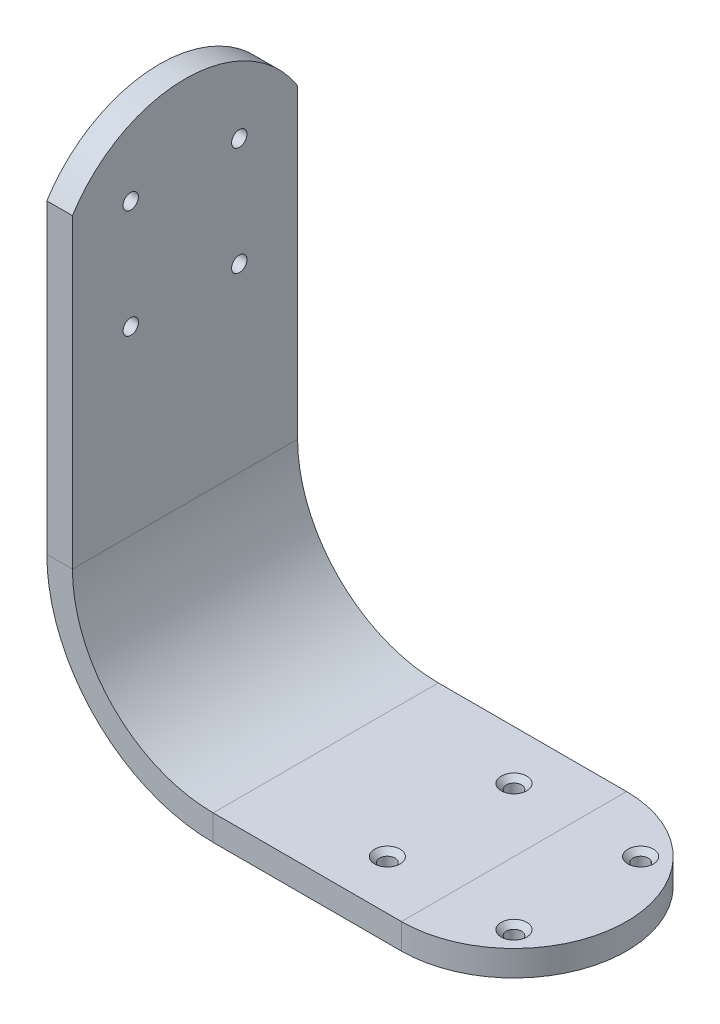
ISO-10303-21;
HEADER;
FILE_DESCRIPTION(('STEP AP214'),'2;1');
FILE_NAME('part.step','',(''),(''),'','','');
FILE_SCHEMA(('AUTOMOTIVE_DESIGN { 1 0 10303 214 1 1 1 1 }'));
ENDSEC;
DATA;
#1=APPLICATION_CONTEXT('core data for automotive mechanical design processes');
#2=APPLICATION_PROTOCOL_DEFINITION('international standard','automotive_design',2000,#1);
#3=PRODUCT_CONTEXT('',#1,'mechanical');
#4=PRODUCT('Part','Part','',(#3));
#5=PRODUCT_RELATED_PRODUCT_CATEGORY('part','',(#4));
#6=PRODUCT_DEFINITION_FORMATION('','',#4);
#7=PRODUCT_DEFINITION_CONTEXT('part definition',#1,'design');
#8=PRODUCT_DEFINITION('design','',#6,#7);
#9=PRODUCT_DEFINITION_SHAPE('','',#8);
#10=(LENGTH_UNIT() NAMED_UNIT(*) SI_UNIT(.MILLI.,.METRE.));
#11=(NAMED_UNIT(*) PLANE_ANGLE_UNIT() SI_UNIT($,.RADIAN.));
#12=(NAMED_UNIT(*) SI_UNIT($,.STERADIAN.) SOLID_ANGLE_UNIT());
#13=UNCERTAINTY_MEASURE_WITH_UNIT(LENGTH_MEASURE(1.E-05),#10,'distance_accuracy_value','');
#14=(GEOMETRIC_REPRESENTATION_CONTEXT(3) GLOBAL_UNCERTAINTY_ASSIGNED_CONTEXT((#13)) GLOBAL_UNIT_ASSIGNED_CONTEXT((#10,
#11,#12)) REPRESENTATION_CONTEXT('',''));
#15=CARTESIAN_POINT('',(0.,0.,0.));
#16=DIRECTION('',(0.,0.,1.));
#17=DIRECTION('',(1.,0.,0.));
#18=AXIS2_PLACEMENT_3D('',#15,#16,#17);
#19=CARTESIAN_POINT('',(66.7922831363969,-61.0217371749099,22.));
#20=DIRECTION('',(0.,-1.,0.));
#21=DIRECTION('',(1.,0.,0.));
#22=AXIS2_PLACEMENT_3D('',#19,#20,#21);
#23=PLANE('',#22);
#24=CARTESIAN_POINT('',(54.4179144656323,-61.0217371749096,12.3743686707647));
#25=DIRECTION('',(0.,1.,0.));
#26=DIRECTION('',(0.,0.,1.));
#27=AXIS2_PLACEMENT_3D('',#24,#25,#26);
#28=CIRCLE('',#27,1.5);
#29=CARTESIAN_POINT('',(54.4179144656323,-61.0217371749096,13.8743686707647));
#30=VERTEX_POINT('',#29);
#31=EDGE_CURVE('E221',#30,#30,#28,.T.);
#32=ORIENTED_EDGE('',*,*,#31,.T.);
#33=EDGE_LOOP('',(#32));
#34=FACE_BOUND('',#33,.T.);
#35=DIRECTION('',(-1.,0.,0.));
#36=VECTOR('',#35,1.);
#37=CARTESIAN_POINT('',(66.7922831363969,-61.0217371749099,22.));
#38=LINE('',#37,#36);
#39=CARTESIAN_POINT('',(66.7922831363969,-61.0217371749099,22.));
#40=VERTEX_POINT('',#39);
#41=CARTESIAN_POINT('',(30.,-61.0217371749097,22.));
#42=VERTEX_POINT('',#41);
#43=EDGE_CURVE('E149',#40,#42,#38,.T.);
#44=ORIENTED_EDGE('',*,*,#43,.T.);
#45=DIRECTION('',(0.,0.,1.));
#46=VECTOR('',#45,1.);
#47=CARTESIAN_POINT('',(30.,-61.0217371749097,22.));
#48=LINE('',#47,#46);
#49=CARTESIAN_POINT('',(30.,-61.0217371749097,-22.));
#50=VERTEX_POINT('',#49);
#51=EDGE_CURVE('E145',#50,#42,#48,.T.);
#52=ORIENTED_EDGE('',*,*,#51,.F.);
#53=DIRECTION('',(-1.,0.,0.));
#54=VECTOR('',#53,1.);
#55=CARTESIAN_POINT('',(66.7922831363969,-61.0217371749099,-22.));
#56=LINE('',#55,#54);
#57=CARTESIAN_POINT('',(66.7922831363969,-61.0217371749099,-22.));
#58=VERTEX_POINT('',#57);
#59=EDGE_CURVE('E150',#58,#50,#56,.T.);
#60=ORIENTED_EDGE('',*,*,#59,.F.);
#61=DIRECTION('',(0.,0.,1.));
#62=VECTOR('',#61,1.);
#63=CARTESIAN_POINT('',(66.7922831363969,-61.0217371749099,22.));
#64=LINE('',#63,#62);
#65=EDGE_CURVE('E140',#58,#40,#64,.T.);
#66=ORIENTED_EDGE('',*,*,#65,.T.);
#67=EDGE_LOOP('',(#44,#52,#60,#66));
#68=FACE_BOUND('',#67,.T.);
#69=CARTESIAN_POINT('',(54.4179144656323,-61.0217371749096,-12.3743686707645));
#70=DIRECTION('',(0.,1.,0.));
#71=DIRECTION('',(0.,0.,1.));
#72=AXIS2_PLACEMENT_3D('',#69,#70,#71);
#73=CIRCLE('',#72,1.5);
#74=CARTESIAN_POINT('',(54.4179144656323,-61.0217371749096,-10.8743686707645));
#75=VERTEX_POINT('',#74);
#76=EDGE_CURVE('E121',#75,#75,#73,.T.);
#77=ORIENTED_EDGE('',*,*,#76,.T.);
#78=EDGE_LOOP('',(#77));
#79=FACE_BOUND('',#78,.T.);
#80=ADVANCED_FACE('F41',(#34,#68,#79),#23,.T.);
#81=CARTESIAN_POINT('',(2.49999999999999,-28.5217371749097,22.));
#82=DIRECTION('',(1.,0.,0.));
#83=DIRECTION('',(0.,1.,0.));
#84=AXIS2_PLACEMENT_3D('',#81,#82,#83);
#85=PLANE('',#84);
#86=CARTESIAN_POINT('',(2.50000000000001,28.046875072252,-10.6066017177982));
#87=DIRECTION('',(1.,0.,0.));
#88=DIRECTION('',(0.,1.,0.));
#89=AXIS2_PLACEMENT_3D('',#86,#87,#88);
#90=CIRCLE('',#89,1.49999999999999);
#91=CARTESIAN_POINT('',(2.50000000000001,29.546875072252,-10.6066017177982));
#92=VERTEX_POINT('',#91);
#93=EDGE_CURVE('E45',#92,#92,#90,.T.);
#94=ORIENTED_EDGE('',*,*,#93,.F.);
#95=EDGE_LOOP('',(#94));
#96=FACE_BOUND('',#95,.T.);
#97=CARTESIAN_POINT('',(2.50000000000001,28.046875072252,10.6066017177982));
#98=DIRECTION('',(1.,0.,0.));
#99=DIRECTION('',(0.,1.,0.));
#100=AXIS2_PLACEMENT_3D('',#97,#98,#99);
#101=CIRCLE('',#100,1.49999999999999);
#102=CARTESIAN_POINT('',(2.50000000000001,29.546875072252,10.6066017177982));
#103=VERTEX_POINT('',#102);
#104=EDGE_CURVE('E179',#103,#103,#101,.T.);
#105=ORIENTED_EDGE('',*,*,#104,.F.);
#106=EDGE_LOOP('',(#105));
#107=FACE_BOUND('',#106,.T.);
#108=CARTESIAN_POINT('',(2.5,6.83367163665562,-10.6066017177983));
#109=DIRECTION('',(1.,0.,0.));
#110=DIRECTION('',(0.,1.,0.));
#111=AXIS2_PLACEMENT_3D('',#108,#109,#110);
#112=CIRCLE('',#111,1.49999999999999);
#113=CARTESIAN_POINT('',(2.5,8.33367163665561,-10.6066017177983));
#114=VERTEX_POINT('',#113);
#115=EDGE_CURVE('E175',#114,#114,#112,.T.);
#116=ORIENTED_EDGE('',*,*,#115,.F.);
#117=EDGE_LOOP('',(#116));
#118=FACE_BOUND('',#117,.T.);
#119=CARTESIAN_POINT('',(2.5,6.83367163665557,10.6066017177982));
#120=DIRECTION('',(1.,0.,0.));
#121=DIRECTION('',(0.,1.,0.));
#122=AXIS2_PLACEMENT_3D('',#119,#120,#121);
#123=CIRCLE('',#122,1.49999999999999);
#124=CARTESIAN_POINT('',(2.5,8.33367163665556,10.6066017177982));
#125=VERTEX_POINT('',#124);
#126=EDGE_CURVE('E170',#125,#125,#123,.T.);
#127=ORIENTED_EDGE('',*,*,#126,.F.);
#128=EDGE_LOOP('',(#127));
#129=FACE_BOUND('',#128,.T.);
#130=DIRECTION('',(0.,1.,0.));
#131=VECTOR('',#130,1.);
#132=CARTESIAN_POINT('',(2.49999999999999,-28.5217371749097,-22.));
#133=LINE('',#132,#131);
#134=CARTESIAN_POINT('',(2.49999999999999,-28.5217371749097,-22.));
#135=VERTEX_POINT('',#134);
#136=CARTESIAN_POINT('',(2.50000000000002,31.2966798150048,-22.));
#137=VERTEX_POINT('',#136);
#138=EDGE_CURVE('E128',#135,#137,#133,.T.);
#139=ORIENTED_EDGE('',*,*,#138,.T.);
#140=CARTESIAN_POINT('',(2.5,17.4402733544538,0.));
#141=DIRECTION('',(1.,0.,0.));
#142=DIRECTION('',(0.,1.,0.));
#143=AXIS2_PLACEMENT_3D('',#140,#141,#142);
#144=CIRCLE('',#143,26.);
#145=CARTESIAN_POINT('',(2.50000000000002,31.2966798150048,22.));
#146=VERTEX_POINT('',#145);
#147=EDGE_CURVE('E111',#137,#146,#144,.T.);
#148=ORIENTED_EDGE('',*,*,#147,.T.);
#149=DIRECTION('',(0.,1.,0.));
#150=VECTOR('',#149,1.);
#151=CARTESIAN_POINT('',(2.49999999999999,-28.5217371749097,22.));
#152=LINE('',#151,#150);
#153=CARTESIAN_POINT('',(2.49999999999999,-28.5217371749097,22.));
#154=VERTEX_POINT('',#153);
#155=EDGE_CURVE('E134',#154,#146,#152,.T.);
#156=ORIENTED_EDGE('',*,*,#155,.F.);
#157=DIRECTION('',(0.,0.,-1.));
#158=VECTOR('',#157,1.);
#159=CARTESIAN_POINT('',(2.49999999999999,-28.5217371749097,22.));
#160=LINE('',#159,#158);
#161=EDGE_CURVE('E272',#154,#135,#160,.T.);
#162=ORIENTED_EDGE('',*,*,#161,.T.);
#163=EDGE_LOOP('',(#139,#148,#156,#162));
#164=FACE_BOUND('',#163,.T.);
#165=ADVANCED_FACE('F340',(#96,#107,#118,#129,#164),#85,.T.);
#166=CARTESIAN_POINT('',(-2.50000000000001,-28.5217371749097,-22.));
#167=DIRECTION('',(0.,0.,-1.));
#168=DIRECTION('',(-1.,0.,0.));
#169=AXIS2_PLACEMENT_3D('',#166,#167,#168);
#170=PLANE('',#169);
#171=DIRECTION('',(0.,1.,0.));
#172=VECTOR('',#171,1.);
#173=CARTESIAN_POINT('',(-2.50000000000001,-28.5217371749097,-22.));
#174=LINE('',#173,#172);
#175=CARTESIAN_POINT('',(-2.50000000000002,-28.5217371749097,-22.));
#176=VERTEX_POINT('',#175);
#177=CARTESIAN_POINT('',(-2.50000000000002,31.2966798150048,-22.));
#178=VERTEX_POINT('',#177);
#179=EDGE_CURVE('E119',#176,#178,#174,.T.);
#180=ORIENTED_EDGE('',*,*,#179,.T.);
#181=DIRECTION('',(-1.,0.,0.));
#182=VECTOR('',#181,1.);
#183=CARTESIAN_POINT('',(88.7922831363969,31.2966798150049,-22.));
#184=LINE('',#183,#182);
#185=EDGE_CURVE('E108',#137,#178,#184,.T.);
#186=ORIENTED_EDGE('',*,*,#185,.F.);
#187=ORIENTED_EDGE('',*,*,#138,.F.);
#188=DIRECTION('',(-1.,0.,0.));
#189=VECTOR('',#188,1.);
#190=CARTESIAN_POINT('',(-2.50000000000001,-28.5217371749097,-22.));
#191=LINE('',#190,#189);
#192=EDGE_CURVE('E126',#135,#176,#191,.T.);
#193=ORIENTED_EDGE('',*,*,#192,.T.);
#194=EDGE_LOOP('',(#180,#186,#187,#193));
#195=FACE_BOUND('',#194,.T.);
#196=ADVANCED_FACE('F124',(#195),#170,.T.);
#197=CARTESIAN_POINT('',(-2.50000000000001,-28.5217371749097,22.));
#198=DIRECTION('',(-1.,0.,0.));
#199=DIRECTION('',(0.,-1.,0.));
#200=AXIS2_PLACEMENT_3D('',#197,#198,#199);
#201=PLANE('',#200);
#202=CARTESIAN_POINT('',(-2.50000000000002,28.046875072252,-10.6066017177982));
#203=DIRECTION('',(-1.,0.,0.));
#204=DIRECTION('',(0.,0.,1.));
#205=AXIS2_PLACEMENT_3D('',#202,#203,#204);
#206=CIRCLE('',#205,3.275);
#207=CARTESIAN_POINT('',(-2.50000000000002,28.046875072252,-7.3316017177982));
#208=VERTEX_POINT('',#207);
#209=EDGE_CURVE('E711',#208,#208,#206,.T.);
#210=ORIENTED_EDGE('',*,*,#209,.F.);
#211=EDGE_LOOP('',(#210));
#212=FACE_BOUND('',#211,.T.);
#213=CARTESIAN_POINT('',(-2.50000000000002,28.046875072252,10.6066017177982));
#214=DIRECTION('',(-1.,0.,0.));
#215=DIRECTION('',(0.,0.,1.));
#216=AXIS2_PLACEMENT_3D('',#213,#214,#215);
#217=CIRCLE('',#216,3.275);
#218=CARTESIAN_POINT('',(-2.50000000000002,28.046875072252,13.8816017177982));
#219=VERTEX_POINT('',#218);
#220=EDGE_CURVE('E721',#219,#219,#217,.T.);
#221=ORIENTED_EDGE('',*,*,#220,.F.);
#222=EDGE_LOOP('',(#221));
#223=FACE_BOUND('',#222,.T.);
#224=CARTESIAN_POINT('',(-2.5,6.83367163665562,-10.6066017177983));
#225=DIRECTION('',(-1.,0.,0.));
#226=DIRECTION('',(0.,0.,1.));
#227=AXIS2_PLACEMENT_3D('',#224,#225,#226);
#228=CIRCLE('',#227,3.275);
#229=CARTESIAN_POINT('',(-2.5,6.83367163665562,-7.33160171779826));
#230=VERTEX_POINT('',#229);
#231=EDGE_CURVE('E181',#230,#230,#228,.T.);
#232=ORIENTED_EDGE('',*,*,#231,.F.);
#233=EDGE_LOOP('',(#232));
#234=FACE_BOUND('',#233,.T.);
#235=CARTESIAN_POINT('',(-2.5,6.83367163665557,10.6066017177982));
#236=DIRECTION('',(-1.,0.,0.));
#237=DIRECTION('',(0.,0.,1.));
#238=AXIS2_PLACEMENT_3D('',#235,#236,#237);
#239=CIRCLE('',#238,3.275);
#240=CARTESIAN_POINT('',(-2.5,6.83367163665557,13.8816017177982));
#241=VERTEX_POINT('',#240);
#242=EDGE_CURVE('E177',#241,#241,#239,.T.);
#243=ORIENTED_EDGE('',*,*,#242,.F.);
#244=EDGE_LOOP('',(#243));
#245=FACE_BOUND('',#244,.T.);
#246=DIRECTION('',(0.,1.,0.));
#247=VECTOR('',#246,1.);
#248=CARTESIAN_POINT('',(-2.50000000000001,-28.5217371749097,22.));
#249=LINE('',#248,#247);
#250=CARTESIAN_POINT('',(-2.50000000000002,-28.5217371749097,22.));
#251=VERTEX_POINT('',#250);
#252=CARTESIAN_POINT('',(-2.49999999999999,31.2966798150048,22.));
#253=VERTEX_POINT('',#252);
#254=EDGE_CURVE('E50',#251,#253,#249,.T.);
#255=ORIENTED_EDGE('',*,*,#254,.T.);
#256=CARTESIAN_POINT('',(-2.50000000000001,17.4402733544538,0.));
#257=DIRECTION('',(-1.,0.,0.));
#258=DIRECTION('',(0.,-1.,0.));
#259=AXIS2_PLACEMENT_3D('',#256,#257,#258);
#260=CIRCLE('',#259,26.);
#261=EDGE_CURVE('E58',#253,#178,#260,.T.);
#262=ORIENTED_EDGE('',*,*,#261,.T.);
#263=ORIENTED_EDGE('',*,*,#179,.F.);
#264=DIRECTION('',(0.,0.,1.));
#265=VECTOR('',#264,1.);
#266=CARTESIAN_POINT('',(-2.50000000000001,-28.5217371749097,22.));
#267=LINE('',#266,#265);
#268=EDGE_CURVE('E154',#176,#251,#267,.T.);
#269=ORIENTED_EDGE('',*,*,#268,.T.);
#270=EDGE_LOOP('',(#255,#262,#263,#269));
#271=FACE_BOUND('',#270,.T.);
#272=ADVANCED_FACE('F117',(#212,#223,#234,#245,#271),#201,.T.);
#273=CARTESIAN_POINT('',(-2.50000000000001,-28.5217371749097,22.));
#274=DIRECTION('',(0.,0.,1.));
#275=DIRECTION('',(1.,0.,0.));
#276=AXIS2_PLACEMENT_3D('',#273,#274,#275);
#277=PLANE('',#276);
#278=ORIENTED_EDGE('',*,*,#155,.T.);
#279=DIRECTION('',(-1.,0.,0.));
#280=VECTOR('',#279,1.);
#281=CARTESIAN_POINT('',(88.7922831363969,31.2966798150048,22.));
#282=LINE('',#281,#280);
#283=EDGE_CURVE('E11',#146,#253,#282,.T.);
#284=ORIENTED_EDGE('',*,*,#283,.T.);
#285=ORIENTED_EDGE('',*,*,#254,.F.);
#286=DIRECTION('',(1.,0.,0.));
#287=VECTOR('',#286,1.);
#288=CARTESIAN_POINT('',(-2.50000000000001,-28.5217371749097,22.));
#289=LINE('',#288,#287);
#290=EDGE_CURVE('E160',#251,#154,#289,.T.);
#291=ORIENTED_EDGE('',*,*,#290,.T.);
#292=EDGE_LOOP('',(#278,#284,#285,#291));
#293=FACE_BOUND('',#292,.T.);
#294=ADVANCED_FACE('F43',(#293),#277,.T.);
#295=CARTESIAN_POINT('',(88.7922831363969,-56.0217371749098,22.));
#296=DIRECTION('',(0.,1.,0.));
#297=DIRECTION('',(0.,0.,1.));
#298=AXIS2_PLACEMENT_3D('',#295,#296,#297);
#299=PLANE('',#298);
#300=CARTESIAN_POINT('',(79.1666518071615,-56.0217371749096,12.3743686707647));
#301=DIRECTION('',(0.,1.,0.));
#302=DIRECTION('',(0.,0.,1.));
#303=AXIS2_PLACEMENT_3D('',#300,#301,#302);
#304=CIRCLE('',#303,2.5);
#305=CARTESIAN_POINT('',(79.1666518071615,-56.0217371749096,14.8743686707647));
#306=VERTEX_POINT('',#305);
#307=EDGE_CURVE('E224',#306,#306,#304,.T.);
#308=ORIENTED_EDGE('',*,*,#307,.F.);
#309=EDGE_LOOP('',(#308));
#310=FACE_BOUND('',#309,.T.);
#311=CARTESIAN_POINT('',(79.1666518071615,-56.0217371749096,-12.3743686707645));
#312=DIRECTION('',(0.,1.,0.));
#313=DIRECTION('',(0.,0.,1.));
#314=AXIS2_PLACEMENT_3D('',#311,#312,#313);
#315=CIRCLE('',#314,2.5);
#316=CARTESIAN_POINT('',(79.1666518071615,-56.0217371749096,-9.87436867076451));
#317=VERTEX_POINT('',#316);
#318=EDGE_CURVE('E233',#317,#317,#315,.T.);
#319=ORIENTED_EDGE('',*,*,#318,.F.);
#320=EDGE_LOOP('',(#319));
#321=FACE_BOUND('',#320,.T.);
#322=DIRECTION('',(0.,0.,-1.));
#323=VECTOR('',#322,1.);
#324=CARTESIAN_POINT('',(66.7922831363969,-56.0217371749098,22.));
#325=LINE('',#324,#323);
#326=CARTESIAN_POINT('',(66.7922831363969,-56.0217371749098,22.));
#327=VERTEX_POINT('',#326);
#328=CARTESIAN_POINT('',(66.7922831363969,-56.0217371749098,-22.));
#329=VERTEX_POINT('',#328);
#330=EDGE_CURVE('E254',#327,#329,#325,.T.);
#331=ORIENTED_EDGE('',*,*,#330,.F.);
#332=CARTESIAN_POINT('',(66.7922831363969,-56.0217371749098,0.));
#333=DIRECTION('',(0.,1.,0.));
#334=DIRECTION('',(0.,0.,1.));
#335=AXIS2_PLACEMENT_3D('',#332,#333,#334);
#336=CIRCLE('',#335,22.);
#337=EDGE_CURVE('E251',#327,#329,#336,.T.);
#338=ORIENTED_EDGE('',*,*,#337,.T.);
#339=EDGE_LOOP('',(#331,#338));
#340=FACE_BOUND('',#339,.T.);
#341=ADVANCED_FACE('F313',(#310,#321,#340),#299,.T.);
#342=CARTESIAN_POINT('',(88.7922831363969,-61.0217371749099,22.));
#343=DIRECTION('',(0.,-1.,0.));
#344=DIRECTION('',(0.,0.,-1.));
#345=AXIS2_PLACEMENT_3D('',#342,#343,#344);
#346=PLANE('',#345);
#347=CARTESIAN_POINT('',(79.1666518071615,-61.0217371749096,12.3743686707647));
#348=DIRECTION('',(0.,1.,0.));
#349=DIRECTION('',(0.,0.,1.));
#350=AXIS2_PLACEMENT_3D('',#347,#348,#349);
#351=CIRCLE('',#350,1.5);
#352=CARTESIAN_POINT('',(79.1666518071615,-61.0217371749096,13.8743686707647));
#353=VERTEX_POINT('',#352);
#354=EDGE_CURVE('E230',#353,#353,#351,.T.);
#355=ORIENTED_EDGE('',*,*,#354,.T.);
#356=EDGE_LOOP('',(#355));
#357=FACE_BOUND('',#356,.T.);
#358=CARTESIAN_POINT('',(79.1666518071615,-61.0217371749096,-12.3743686707645));
#359=DIRECTION('',(0.,1.,0.));
#360=DIRECTION('',(0.,0.,1.));
#361=AXIS2_PLACEMENT_3D('',#358,#359,#360);
#362=CIRCLE('',#361,1.5);
#363=CARTESIAN_POINT('',(79.1666518071615,-61.0217371749096,-10.8743686707645));
#364=VERTEX_POINT('',#363);
#365=EDGE_CURVE('E239',#364,#364,#362,.T.);
#366=ORIENTED_EDGE('',*,*,#365,.T.);
#367=EDGE_LOOP('',(#366));
#368=FACE_BOUND('',#367,.T.);
#369=CARTESIAN_POINT('',(66.7922831363969,-61.0217371749099,0.));
#370=DIRECTION('',(0.,1.,0.));
#371=DIRECTION('',(0.,0.,1.));
#372=AXIS2_PLACEMENT_3D('',#369,#370,#371);
#373=CIRCLE('',#372,22.);
#374=EDGE_CURVE('E252',#40,#58,#373,.T.);
#375=ORIENTED_EDGE('',*,*,#374,.F.);
#376=ORIENTED_EDGE('',*,*,#65,.F.);
#377=EDGE_LOOP('',(#375,#376));
#378=FACE_BOUND('',#377,.T.);
#379=ADVANCED_FACE('F321',(#357,#368,#378),#346,.T.);
#380=CARTESIAN_POINT('',(66.7922831363969,-56.0217371749098,22.));
#381=DIRECTION('',(0.,1.,0.));
#382=DIRECTION('',(-1.,0.,0.));
#383=AXIS2_PLACEMENT_3D('',#380,#381,#382);
#384=PLANE('',#383);
#385=CARTESIAN_POINT('',(54.4179144656323,-56.0217371749096,12.3743686707647));
#386=DIRECTION('',(0.,1.,0.));
#387=DIRECTION('',(0.,0.,1.));
#388=AXIS2_PLACEMENT_3D('',#385,#386,#387);
#389=CIRCLE('',#388,2.5);
#390=CARTESIAN_POINT('',(54.4179144656323,-56.0217371749096,14.8743686707647));
#391=VERTEX_POINT('',#390);
#392=EDGE_CURVE('E173',#391,#391,#389,.T.);
#393=ORIENTED_EDGE('',*,*,#392,.F.);
#394=EDGE_LOOP('',(#393));
#395=FACE_BOUND('',#394,.T.);
#396=CARTESIAN_POINT('',(54.4179144656323,-56.0217371749096,-12.3743686707645));
#397=DIRECTION('',(0.,1.,0.));
#398=DIRECTION('',(0.,0.,1.));
#399=AXIS2_PLACEMENT_3D('',#396,#397,#398);
#400=CIRCLE('',#399,2.5);
#401=CARTESIAN_POINT('',(54.4179144656323,-56.0217371749096,-9.8743686707645));
#402=VERTEX_POINT('',#401);
#403=EDGE_CURVE('E242',#402,#402,#400,.T.);
#404=ORIENTED_EDGE('',*,*,#403,.F.);
#405=EDGE_LOOP('',(#404));
#406=FACE_BOUND('',#405,.T.);
#407=DIRECTION('',(-1.,0.,0.));
#408=VECTOR('',#407,1.);
#409=CARTESIAN_POINT('',(66.7922831363969,-56.0217371749098,-22.));
#410=LINE('',#409,#408);
#411=CARTESIAN_POINT('',(30.,-56.0217371749097,-22.));
#412=VERTEX_POINT('',#411);
#413=EDGE_CURVE('E265',#329,#412,#410,.T.);
#414=ORIENTED_EDGE('',*,*,#413,.T.);
#415=DIRECTION('',(0.,0.,-1.));
#416=VECTOR('',#415,1.);
#417=CARTESIAN_POINT('',(30.,-56.0217371749097,22.));
#418=LINE('',#417,#416);
#419=CARTESIAN_POINT('',(30.,-56.0217371749097,22.));
#420=VERTEX_POINT('',#419);
#421=EDGE_CURVE('E261',#420,#412,#418,.T.);
#422=ORIENTED_EDGE('',*,*,#421,.F.);
#423=DIRECTION('',(-1.,0.,0.));
#424=VECTOR('',#423,1.);
#425=CARTESIAN_POINT('',(66.7922831363969,-56.0217371749098,22.));
#426=LINE('',#425,#424);
#427=EDGE_CURVE('E164',#327,#420,#426,.T.);
#428=ORIENTED_EDGE('',*,*,#427,.F.);
#429=ORIENTED_EDGE('',*,*,#330,.T.);
#430=EDGE_LOOP('',(#414,#422,#428,#429));
#431=FACE_BOUND('',#430,.T.);
#432=ADVANCED_FACE('F315',(#395,#406,#431),#384,.T.);
#433=CARTESIAN_POINT('',(66.7922831363969,-61.0217371749099,-22.));
#434=DIRECTION('',(0.,0.,-1.));
#435=DIRECTION('',(-1.,0.,0.));
#436=AXIS2_PLACEMENT_3D('',#433,#434,#435);
#437=PLANE('',#436);
#438=ORIENTED_EDGE('',*,*,#59,.T.);
#439=DIRECTION('',(0.,-1.,0.));
#440=VECTOR('',#439,1.);
#441=CARTESIAN_POINT('',(30.,-61.0217371749097,-22.));
#442=LINE('',#441,#440);
#443=EDGE_CURVE('E269',#412,#50,#442,.T.);
#444=ORIENTED_EDGE('',*,*,#443,.F.);
#445=ORIENTED_EDGE('',*,*,#413,.F.);
#446=DIRECTION('',(0.,-1.,0.));
#447=VECTOR('',#446,1.);
#448=CARTESIAN_POINT('',(66.7922831363969,-61.0217371749099,-22.));
#449=LINE('',#448,#447);
#450=EDGE_CURVE('E144',#329,#58,#449,.T.);
#451=ORIENTED_EDGE('',*,*,#450,.T.);
#452=EDGE_LOOP('',(#438,#444,#445,#451));
#453=FACE_BOUND('',#452,.T.);
#454=ADVANCED_FACE('F305',(#453),#437,.T.);
#455=CARTESIAN_POINT('',(66.7922831363969,-61.0217371749099,22.));
#456=DIRECTION('',(0.,0.,1.));
#457=DIRECTION('',(1.,0.,0.));
#458=AXIS2_PLACEMENT_3D('',#455,#456,#457);
#459=PLANE('',#458);
#460=DIRECTION('',(0.,1.,0.));
#461=VECTOR('',#460,1.);
#462=CARTESIAN_POINT('',(30.,-61.0217371749097,22.));
#463=LINE('',#462,#461);
#464=EDGE_CURVE('E153',#42,#420,#463,.T.);
#465=ORIENTED_EDGE('',*,*,#464,.F.);
#466=ORIENTED_EDGE('',*,*,#43,.F.);
#467=DIRECTION('',(0.,1.,0.));
#468=VECTOR('',#467,1.);
#469=CARTESIAN_POINT('',(66.7922831363969,-61.0217371749099,22.));
#470=LINE('',#469,#468);
#471=EDGE_CURVE('E143',#40,#327,#470,.T.);
#472=ORIENTED_EDGE('',*,*,#471,.T.);
#473=ORIENTED_EDGE('',*,*,#427,.T.);
#474=EDGE_LOOP('',(#465,#466,#472,#473));
#475=FACE_BOUND('',#474,.T.);
#476=ADVANCED_FACE('F319',(#475),#459,.T.);
#477=CARTESIAN_POINT('',(30.,-28.5217371749097,0.));
#478=DIRECTION('',(0.,0.,-1.));
#479=DIRECTION('',(-1.,0.,0.));
#480=AXIS2_PLACEMENT_3D('',#477,#478,#479);
#481=CYLINDRICAL_SURFACE('',#480,27.5);
#482=CARTESIAN_POINT('',(30.,-28.5217371749097,-22.));
#483=DIRECTION('',(0.,0.,-1.));
#484=DIRECTION('',(0.,-1.,0.));
#485=AXIS2_PLACEMENT_3D('',#482,#483,#484);
#486=CIRCLE('',#485,27.5);
#487=EDGE_CURVE('E276',#412,#135,#486,.T.);
#488=ORIENTED_EDGE('',*,*,#487,.T.);
#489=ORIENTED_EDGE('',*,*,#161,.F.);
#490=CARTESIAN_POINT('',(30.,-28.5217371749097,22.));
#491=DIRECTION('',(0.,0.,-1.));
#492=DIRECTION('',(0.,-1.,0.));
#493=AXIS2_PLACEMENT_3D('',#490,#491,#492);
#494=CIRCLE('',#493,27.5);
#495=EDGE_CURVE('E167',#420,#154,#494,.T.);
#496=ORIENTED_EDGE('',*,*,#495,.F.);
#497=ORIENTED_EDGE('',*,*,#421,.T.);
#498=EDGE_LOOP('',(#488,#489,#496,#497));
#499=FACE_BOUND('',#498,.T.);
#500=ADVANCED_FACE('F354',(#499),#481,.F.);
#501=CARTESIAN_POINT('',(30.,-61.0217371749097,-22.));
#502=DIRECTION('',(0.,0.,-1.));
#503=DIRECTION('',(-1.,0.,0.));
#504=AXIS2_PLACEMENT_3D('',#501,#502,#503);
#505=PLANE('',#504);
#506=CARTESIAN_POINT('',(30.,-28.5217371749097,-22.));
#507=DIRECTION('',(0.,0.,-1.));
#508=DIRECTION('',(0.,-1.,0.));
#509=AXIS2_PLACEMENT_3D('',#506,#507,#508);
#510=CIRCLE('',#509,32.5);
#511=EDGE_CURVE('E138',#50,#176,#510,.T.);
#512=ORIENTED_EDGE('',*,*,#511,.T.);
#513=ORIENTED_EDGE('',*,*,#192,.F.);
#514=ORIENTED_EDGE('',*,*,#487,.F.);
#515=ORIENTED_EDGE('',*,*,#443,.T.);
#516=EDGE_LOOP('',(#512,#513,#514,#515));
#517=FACE_BOUND('',#516,.T.);
#518=ADVANCED_FACE('F294',(#517),#505,.T.);
#519=CARTESIAN_POINT('',(30.,-28.5217371749097,0.));
#520=DIRECTION('',(0.,0.,-1.));
#521=DIRECTION('',(-1.,0.,0.));
#522=AXIS2_PLACEMENT_3D('',#519,#520,#521);
#523=CYLINDRICAL_SURFACE('',#522,32.5);
#524=CARTESIAN_POINT('',(30.,-28.5217371749097,22.));
#525=DIRECTION('',(0.,0.,-1.));
#526=DIRECTION('',(0.,-1.,0.));
#527=AXIS2_PLACEMENT_3D('',#524,#525,#526);
#528=CIRCLE('',#527,32.5);
#529=EDGE_CURVE('E157',#42,#251,#528,.T.);
#530=ORIENTED_EDGE('',*,*,#529,.T.);
#531=ORIENTED_EDGE('',*,*,#268,.F.);
#532=ORIENTED_EDGE('',*,*,#511,.F.);
#533=ORIENTED_EDGE('',*,*,#51,.T.);
#534=EDGE_LOOP('',(#530,#531,#532,#533));
#535=FACE_BOUND('',#534,.T.);
#536=ADVANCED_FACE('F298',(#535),#523,.T.);
#537=CARTESIAN_POINT('',(30.,-61.0217371749097,22.));
#538=DIRECTION('',(0.,0.,1.));
#539=DIRECTION('',(1.,0.,0.));
#540=AXIS2_PLACEMENT_3D('',#537,#538,#539);
#541=PLANE('',#540);
#542=ORIENTED_EDGE('',*,*,#290,.F.);
#543=ORIENTED_EDGE('',*,*,#529,.F.);
#544=ORIENTED_EDGE('',*,*,#464,.T.);
#545=ORIENTED_EDGE('',*,*,#495,.T.);
#546=EDGE_LOOP('',(#542,#543,#544,#545));
#547=FACE_BOUND('',#546,.T.);
#548=ADVANCED_FACE('F325',(#547),#541,.T.);
#549=CARTESIAN_POINT('',(66.7922831363969,-61.0217371749099,0.));
#550=DIRECTION('',(0.,1.,0.));
#551=DIRECTION('',(0.,0.,1.));
#552=AXIS2_PLACEMENT_3D('',#549,#550,#551);
#553=CYLINDRICAL_SURFACE('',#552,22.);
#554=ORIENTED_EDGE('',*,*,#337,.F.);
#555=ORIENTED_EDGE('',*,*,#471,.F.);
#556=ORIENTED_EDGE('',*,*,#374,.T.);
#557=ORIENTED_EDGE('',*,*,#450,.F.);
#558=EDGE_LOOP('',(#554,#555,#556,#557));
#559=FACE_BOUND('',#558,.T.);
#560=ADVANCED_FACE('F308',(#559),#553,.T.);
#561=CARTESIAN_POINT('',(88.7922831363969,17.4402733544539,0.));
#562=DIRECTION('',(-1.,0.,0.));
#563=DIRECTION('',(0.,-1.,0.));
#564=AXIS2_PLACEMENT_3D('',#561,#562,#563);
#565=CYLINDRICAL_SURFACE('',#564,26.);
#566=ORIENTED_EDGE('',*,*,#185,.T.);
#567=ORIENTED_EDGE('',*,*,#261,.F.);
#568=ORIENTED_EDGE('',*,*,#283,.F.);
#569=ORIENTED_EDGE('',*,*,#147,.F.);
#570=EDGE_LOOP('',(#566,#567,#568,#569));
#571=FACE_BOUND('',#570,.T.);
#572=ADVANCED_FACE('F109',(#571),#565,.T.);
#573=CARTESIAN_POINT('',(54.4179144656323,-56.0217371749096,-12.3743686707645));
#574=DIRECTION('',(0.,1.,0.));
#575=DIRECTION('',(0.,0.,1.));
#576=AXIS2_PLACEMENT_3D('',#573,#574,#575);
#577=CYLINDRICAL_SURFACE('',#576,1.5);
#578=ORIENTED_EDGE('',*,*,#76,.F.);
#579=EDGE_LOOP('',(#578));
#580=FACE_BOUND('',#579,.T.);
#581=CARTESIAN_POINT('',(54.4179144656323,-57.0217371749096,-12.3743686707645));
#582=DIRECTION('',(0.,1.,0.));
#583=DIRECTION('',(0.,0.,1.));
#584=AXIS2_PLACEMENT_3D('',#581,#582,#583);
#585=CIRCLE('',#584,1.5);
#586=CARTESIAN_POINT('',(54.4179144656323,-57.0217371749096,-10.8743686707645));
#587=VERTEX_POINT('',#586);
#588=EDGE_CURVE('E245',#587,#587,#585,.T.);
#589=ORIENTED_EDGE('',*,*,#588,.T.);
#590=EDGE_LOOP('',(#589));
#591=FACE_BOUND('',#590,.T.);
#592=ADVANCED_FACE('F407',(#580,#591),#577,.F.);
#593=CARTESIAN_POINT('',(54.4179144656323,-56.0217371749096,-12.3743686707645));
#594=DIRECTION('',(0.,1.,0.));
#595=DIRECTION('',(0.,0.,1.));
#596=AXIS2_PLACEMENT_3D('',#593,#594,#595);
#597=CONICAL_SURFACE('',#596,2.5,0.785398163397448);
#598=ORIENTED_EDGE('',*,*,#588,.F.);
#599=EDGE_LOOP('',(#598));
#600=FACE_BOUND('',#599,.T.);
#601=ORIENTED_EDGE('',*,*,#403,.T.);
#602=EDGE_LOOP('',(#601));
#603=FACE_BOUND('',#602,.T.);
#604=ADVANCED_FACE('F412',(#600,#603),#597,.F.);
#605=CARTESIAN_POINT('',(79.1666518071615,-56.0217371749096,-12.3743686707645));
#606=DIRECTION('',(0.,1.,0.));
#607=DIRECTION('',(0.,0.,1.));
#608=AXIS2_PLACEMENT_3D('',#605,#606,#607);
#609=CYLINDRICAL_SURFACE('',#608,1.5);
#610=ORIENTED_EDGE('',*,*,#365,.F.);
#611=EDGE_LOOP('',(#610));
#612=FACE_BOUND('',#611,.T.);
#613=CARTESIAN_POINT('',(79.1666518071615,-57.0217371749096,-12.3743686707645));
#614=DIRECTION('',(0.,1.,0.));
#615=DIRECTION('',(0.,0.,1.));
#616=AXIS2_PLACEMENT_3D('',#613,#614,#615);
#617=CIRCLE('',#616,1.5);
#618=CARTESIAN_POINT('',(79.1666518071615,-57.0217371749096,-10.8743686707645));
#619=VERTEX_POINT('',#618);
#620=EDGE_CURVE('E236',#619,#619,#617,.T.);
#621=ORIENTED_EDGE('',*,*,#620,.T.);
#622=EDGE_LOOP('',(#621));
#623=FACE_BOUND('',#622,.T.);
#624=ADVANCED_FACE('F423',(#612,#623),#609,.F.);
#625=CARTESIAN_POINT('',(79.1666518071615,-56.0217371749096,-12.3743686707645));
#626=DIRECTION('',(0.,1.,0.));
#627=DIRECTION('',(0.,0.,1.));
#628=AXIS2_PLACEMENT_3D('',#625,#626,#627);
#629=CONICAL_SURFACE('',#628,2.5,0.785398163397448);
#630=ORIENTED_EDGE('',*,*,#620,.F.);
#631=EDGE_LOOP('',(#630));
#632=FACE_BOUND('',#631,.T.);
#633=ORIENTED_EDGE('',*,*,#318,.T.);
#634=EDGE_LOOP('',(#633));
#635=FACE_BOUND('',#634,.T.);
#636=ADVANCED_FACE('F433',(#632,#635),#629,.F.);
#637=CARTESIAN_POINT('',(79.1666518071615,-56.0217371749096,12.3743686707647));
#638=DIRECTION('',(0.,1.,0.));
#639=DIRECTION('',(0.,0.,1.));
#640=AXIS2_PLACEMENT_3D('',#637,#638,#639);
#641=CYLINDRICAL_SURFACE('',#640,1.5);
#642=ORIENTED_EDGE('',*,*,#354,.F.);
#643=EDGE_LOOP('',(#642));
#644=FACE_BOUND('',#643,.T.);
#645=CARTESIAN_POINT('',(79.1666518071615,-57.0217371749096,12.3743686707647));
#646=DIRECTION('',(0.,1.,0.));
#647=DIRECTION('',(0.,0.,1.));
#648=AXIS2_PLACEMENT_3D('',#645,#646,#647);
#649=CIRCLE('',#648,1.5);
#650=CARTESIAN_POINT('',(79.1666518071615,-57.0217371749096,13.8743686707647));
#651=VERTEX_POINT('',#650);
#652=EDGE_CURVE('E227',#651,#651,#649,.T.);
#653=ORIENTED_EDGE('',*,*,#652,.T.);
#654=EDGE_LOOP('',(#653));
#655=FACE_BOUND('',#654,.T.);
#656=ADVANCED_FACE('F443',(#644,#655),#641,.F.);
#657=CARTESIAN_POINT('',(79.1666518071615,-56.0217371749096,12.3743686707647));
#658=DIRECTION('',(0.,1.,0.));
#659=DIRECTION('',(0.,0.,1.));
#660=AXIS2_PLACEMENT_3D('',#657,#658,#659);
#661=CONICAL_SURFACE('',#660,2.5,0.785398163397448);
#662=ORIENTED_EDGE('',*,*,#652,.F.);
#663=EDGE_LOOP('',(#662));
#664=FACE_BOUND('',#663,.T.);
#665=ORIENTED_EDGE('',*,*,#307,.T.);
#666=EDGE_LOOP('',(#665));
#667=FACE_BOUND('',#666,.T.);
#668=ADVANCED_FACE('F453',(#664,#667),#661,.F.);
#669=CARTESIAN_POINT('',(54.4179144656323,-56.0217371749096,12.3743686707647));
#670=DIRECTION('',(0.,1.,0.));
#671=DIRECTION('',(0.,0.,1.));
#672=AXIS2_PLACEMENT_3D('',#669,#670,#671);
#673=CYLINDRICAL_SURFACE('',#672,1.5);
#674=ORIENTED_EDGE('',*,*,#31,.F.);
#675=EDGE_LOOP('',(#674));
#676=FACE_BOUND('',#675,.T.);
#677=CARTESIAN_POINT('',(54.4179144656323,-57.0217371749096,12.3743686707647));
#678=DIRECTION('',(0.,1.,0.));
#679=DIRECTION('',(0.,0.,1.));
#680=AXIS2_PLACEMENT_3D('',#677,#678,#679);
#681=CIRCLE('',#680,1.5);
#682=CARTESIAN_POINT('',(54.4179144656323,-57.0217371749096,13.8743686707647));
#683=VERTEX_POINT('',#682);
#684=EDGE_CURVE('E218',#683,#683,#681,.T.);
#685=ORIENTED_EDGE('',*,*,#684,.T.);
#686=EDGE_LOOP('',(#685));
#687=FACE_BOUND('',#686,.T.);
#688=ADVANCED_FACE('F463',(#676,#687),#673,.F.);
#689=CARTESIAN_POINT('',(54.4179144656323,-56.0217371749096,12.3743686707647));
#690=DIRECTION('',(0.,1.,0.));
#691=DIRECTION('',(0.,0.,1.));
#692=AXIS2_PLACEMENT_3D('',#689,#690,#691);
#693=CONICAL_SURFACE('',#692,2.5,0.785398163397448);
#694=ORIENTED_EDGE('',*,*,#684,.F.);
#695=EDGE_LOOP('',(#694));
#696=FACE_BOUND('',#695,.T.);
#697=ORIENTED_EDGE('',*,*,#392,.T.);
#698=EDGE_LOOP('',(#697));
#699=FACE_BOUND('',#698,.T.);
#700=ADVANCED_FACE('F473',(#696,#699),#693,.F.);
#701=CARTESIAN_POINT('',(-2.5,6.83367163665557,10.6066017177982));
#702=DIRECTION('',(-1.,0.,0.));
#703=DIRECTION('',(0.,0.,1.));
#704=AXIS2_PLACEMENT_3D('',#701,#702,#703);
#705=CYLINDRICAL_SURFACE('',#704,1.49999999999999);
#706=ORIENTED_EDGE('',*,*,#126,.T.);
#707=EDGE_LOOP('',(#706));
#708=FACE_BOUND('',#707,.T.);
#709=CARTESIAN_POINT('',(-1.,6.83367163665557,10.6066017177982));
#710=DIRECTION('',(-1.,0.,0.));
#711=DIRECTION('',(0.,0.,1.));
#712=AXIS2_PLACEMENT_3D('',#709,#710,#711);
#713=CIRCLE('',#712,1.50000000000001);
#714=CARTESIAN_POINT('',(-1.,6.83367163665557,12.1066017177982));
#715=VERTEX_POINT('',#714);
#716=EDGE_CURVE('E174',#715,#715,#713,.T.);
#717=ORIENTED_EDGE('',*,*,#716,.T.);
#718=EDGE_LOOP('',(#717));
#719=FACE_BOUND('',#718,.T.);
#720=ADVANCED_FACE('F483',(#708,#719),#705,.F.);
#721=CARTESIAN_POINT('',(-1.,9.58367163665557,10.6066017177982));
#722=DIRECTION('',(1.,0.,0.));
#723=DIRECTION('',(0.,0.,-1.));
#724=AXIS2_PLACEMENT_3D('',#721,#722,#723);
#725=PLANE('',#724);
#726=ORIENTED_EDGE('',*,*,#716,.F.);
#727=EDGE_LOOP('',(#726));
#728=FACE_BOUND('',#727,.T.);
#729=CARTESIAN_POINT('',(-1.,6.83367163665557,10.6066017177982));
#730=DIRECTION('',(-1.,0.,0.));
#731=DIRECTION('',(0.,0.,1.));
#732=AXIS2_PLACEMENT_3D('',#729,#730,#731);
#733=CIRCLE('',#732,2.75);
#734=CARTESIAN_POINT('',(-1.,6.83367163665557,13.3566017177982));
#735=VERTEX_POINT('',#734);
#736=EDGE_CURVE('E211',#735,#735,#733,.T.);
#737=ORIENTED_EDGE('',*,*,#736,.T.);
#738=EDGE_LOOP('',(#737));
#739=FACE_BOUND('',#738,.T.);
#740=ADVANCED_FACE('F503',(#728,#739),#725,.F.);
#741=CARTESIAN_POINT('',(-2.5,6.83367163665557,10.6066017177982));
#742=DIRECTION('',(-1.,0.,0.));
#743=DIRECTION('',(0.,0.,1.));
#744=AXIS2_PLACEMENT_3D('',#741,#742,#743);
#745=CYLINDRICAL_SURFACE('',#744,2.75);
#746=ORIENTED_EDGE('',*,*,#736,.F.);
#747=EDGE_LOOP('',(#746));
#748=FACE_BOUND('',#747,.T.);
#749=CARTESIAN_POINT('',(-1.975,6.83367163665557,10.6066017177982));
#750=DIRECTION('',(-1.,0.,0.));
#751=DIRECTION('',(0.,0.,1.));
#752=AXIS2_PLACEMENT_3D('',#749,#750,#751);
#753=CIRCLE('',#752,2.75);
#754=CARTESIAN_POINT('',(-1.975,6.83367163665557,13.3566017177982));
#755=VERTEX_POINT('',#754);
#756=EDGE_CURVE('E208',#755,#755,#753,.T.);
#757=ORIENTED_EDGE('',*,*,#756,.T.);
#758=EDGE_LOOP('',(#757));
#759=FACE_BOUND('',#758,.T.);
#760=ADVANCED_FACE('F513',(#748,#759),#745,.F.);
#761=CARTESIAN_POINT('',(-2.5,6.83367163665557,10.6066017177982));
#762=DIRECTION('',(-1.,0.,0.));
#763=DIRECTION('',(0.,0.,1.));
#764=AXIS2_PLACEMENT_3D('',#761,#762,#763);
#765=CONICAL_SURFACE('',#764,3.275,0.785398163397448);
#766=ORIENTED_EDGE('',*,*,#756,.F.);
#767=EDGE_LOOP('',(#766));
#768=FACE_BOUND('',#767,.T.);
#769=ORIENTED_EDGE('',*,*,#242,.T.);
#770=EDGE_LOOP('',(#769));
#771=FACE_BOUND('',#770,.T.);
#772=ADVANCED_FACE('F523',(#768,#771),#765,.F.);
#773=CARTESIAN_POINT('',(-2.5,6.83367163665562,-10.6066017177983));
#774=DIRECTION('',(-1.,0.,0.));
#775=DIRECTION('',(0.,0.,1.));
#776=AXIS2_PLACEMENT_3D('',#773,#774,#775);
#777=CYLINDRICAL_SURFACE('',#776,1.49999999999999);
#778=ORIENTED_EDGE('',*,*,#115,.T.);
#779=EDGE_LOOP('',(#778));
#780=FACE_BOUND('',#779,.T.);
#781=CARTESIAN_POINT('',(-1.,6.83367163665562,-10.6066017177983));
#782=DIRECTION('',(-1.,0.,0.));
#783=DIRECTION('',(0.,0.,1.));
#784=AXIS2_PLACEMENT_3D('',#781,#782,#783);
#785=CIRCLE('',#784,1.50000000000001);
#786=CARTESIAN_POINT('',(-1.,6.83367163665562,-9.10660171779824));
#787=VERTEX_POINT('',#786);
#788=EDGE_CURVE('E178',#787,#787,#785,.T.);
#789=ORIENTED_EDGE('',*,*,#788,.T.);
#790=EDGE_LOOP('',(#789));
#791=FACE_BOUND('',#790,.T.);
#792=ADVANCED_FACE('F533',(#780,#791),#777,.F.);
#793=CARTESIAN_POINT('',(-1.,9.58367163665562,-10.6066017177983));
#794=DIRECTION('',(1.,0.,0.));
#795=DIRECTION('',(0.,0.,-1.));
#796=AXIS2_PLACEMENT_3D('',#793,#794,#795);
#797=PLANE('',#796);
#798=ORIENTED_EDGE('',*,*,#788,.F.);
#799=EDGE_LOOP('',(#798));
#800=FACE_BOUND('',#799,.T.);
#801=CARTESIAN_POINT('',(-1.,6.83367163665562,-10.6066017177983));
#802=DIRECTION('',(-1.,0.,0.));
#803=DIRECTION('',(0.,0.,1.));
#804=AXIS2_PLACEMENT_3D('',#801,#802,#803);
#805=CIRCLE('',#804,2.75);
#806=CARTESIAN_POINT('',(-1.,6.83367163665562,-7.85660171779826));
#807=VERTEX_POINT('',#806);
#808=EDGE_CURVE('E201',#807,#807,#805,.T.);
#809=ORIENTED_EDGE('',*,*,#808,.T.);
#810=EDGE_LOOP('',(#809));
#811=FACE_BOUND('',#810,.T.);
#812=ADVANCED_FACE('F543',(#800,#811),#797,.F.);
#813=CARTESIAN_POINT('',(-2.5,6.83367163665562,-10.6066017177983));
#814=DIRECTION('',(-1.,0.,0.));
#815=DIRECTION('',(0.,0.,1.));
#816=AXIS2_PLACEMENT_3D('',#813,#814,#815);
#817=CYLINDRICAL_SURFACE('',#816,2.75);
#818=ORIENTED_EDGE('',*,*,#808,.F.);
#819=EDGE_LOOP('',(#818));
#820=FACE_BOUND('',#819,.T.);
#821=CARTESIAN_POINT('',(-1.975,6.83367163665562,-10.6066017177983));
#822=DIRECTION('',(-1.,0.,0.));
#823=DIRECTION('',(0.,0.,1.));
#824=AXIS2_PLACEMENT_3D('',#821,#822,#823);
#825=CIRCLE('',#824,2.75);
#826=CARTESIAN_POINT('',(-1.975,6.83367163665562,-7.85660171779826));
#827=VERTEX_POINT('',#826);
#828=EDGE_CURVE('E186',#827,#827,#825,.T.);
#829=ORIENTED_EDGE('',*,*,#828,.T.);
#830=EDGE_LOOP('',(#829));
#831=FACE_BOUND('',#830,.T.);
#832=ADVANCED_FACE('F553',(#820,#831),#817,.F.);
#833=CARTESIAN_POINT('',(-2.5,6.83367163665562,-10.6066017177983));
#834=DIRECTION('',(-1.,0.,0.));
#835=DIRECTION('',(0.,0.,1.));
#836=AXIS2_PLACEMENT_3D('',#833,#834,#835);
#837=CONICAL_SURFACE('',#836,3.275,0.785398163397448);
#838=ORIENTED_EDGE('',*,*,#828,.F.);
#839=EDGE_LOOP('',(#838));
#840=FACE_BOUND('',#839,.T.);
#841=ORIENTED_EDGE('',*,*,#231,.T.);
#842=EDGE_LOOP('',(#841));
#843=FACE_BOUND('',#842,.T.);
#844=ADVANCED_FACE('F563',(#840,#843),#837,.F.);
#845=CARTESIAN_POINT('',(-2.50000000000002,28.046875072252,10.6066017177982));
#846=DIRECTION('',(-1.,0.,0.));
#847=DIRECTION('',(0.,0.,1.));
#848=AXIS2_PLACEMENT_3D('',#845,#846,#847);
#849=CYLINDRICAL_SURFACE('',#848,1.49999999999999);
#850=ORIENTED_EDGE('',*,*,#104,.T.);
#851=EDGE_LOOP('',(#850));
#852=FACE_BOUND('',#851,.T.);
#853=CARTESIAN_POINT('',(-1.00000000000002,28.046875072252,10.6066017177982));
#854=DIRECTION('',(-1.,0.,0.));
#855=DIRECTION('',(0.,0.,1.));
#856=AXIS2_PLACEMENT_3D('',#853,#854,#855);
#857=CIRCLE('',#856,1.50000000000001);
#858=CARTESIAN_POINT('',(-1.00000000000002,28.046875072252,12.1066017177982));
#859=VERTEX_POINT('',#858);
#860=EDGE_CURVE('E182',#859,#859,#857,.T.);
#861=ORIENTED_EDGE('',*,*,#860,.T.);
#862=EDGE_LOOP('',(#861));
#863=FACE_BOUND('',#862,.T.);
#864=ADVANCED_FACE('F573',(#852,#863),#849,.F.);
#865=CARTESIAN_POINT('',(-1.00000000000002,30.796875072252,10.6066017177982));
#866=DIRECTION('',(1.,0.,0.));
#867=DIRECTION('',(0.,0.,-1.));
#868=AXIS2_PLACEMENT_3D('',#865,#866,#867);
#869=PLANE('',#868);
#870=ORIENTED_EDGE('',*,*,#860,.F.);
#871=EDGE_LOOP('',(#870));
#872=FACE_BOUND('',#871,.T.);
#873=CARTESIAN_POINT('',(-1.00000000000002,28.046875072252,10.6066017177982));
#874=DIRECTION('',(-1.,0.,0.));
#875=DIRECTION('',(0.,0.,1.));
#876=AXIS2_PLACEMENT_3D('',#873,#874,#875);
#877=CIRCLE('',#876,2.75);
#878=CARTESIAN_POINT('',(-1.00000000000002,28.046875072252,13.3566017177982));
#879=VERTEX_POINT('',#878);
#880=EDGE_CURVE('E189',#879,#879,#877,.T.);
#881=ORIENTED_EDGE('',*,*,#880,.T.);
#882=EDGE_LOOP('',(#881));
#883=FACE_BOUND('',#882,.T.);
#884=ADVANCED_FACE('F583',(#872,#883),#869,.F.);
#885=CARTESIAN_POINT('',(-2.50000000000002,28.046875072252,10.6066017177982));
#886=DIRECTION('',(-1.,0.,0.));
#887=DIRECTION('',(0.,0.,1.));
#888=AXIS2_PLACEMENT_3D('',#885,#886,#887);
#889=CYLINDRICAL_SURFACE('',#888,2.75);
#890=ORIENTED_EDGE('',*,*,#880,.F.);
#891=EDGE_LOOP('',(#890));
#892=FACE_BOUND('',#891,.T.);
#893=CARTESIAN_POINT('',(-1.97500000000001,28.046875072252,10.6066017177982));
#894=DIRECTION('',(-1.,0.,0.));
#895=DIRECTION('',(0.,0.,1.));
#896=AXIS2_PLACEMENT_3D('',#893,#894,#895);
#897=CIRCLE('',#896,2.75);
#898=CARTESIAN_POINT('',(-1.97500000000001,28.046875072252,13.3566017177982));
#899=VERTEX_POINT('',#898);
#900=EDGE_CURVE('E194',#899,#899,#897,.T.);
#901=ORIENTED_EDGE('',*,*,#900,.T.);
#902=EDGE_LOOP('',(#901));
#903=FACE_BOUND('',#902,.T.);
#904=ADVANCED_FACE('F592',(#892,#903),#889,.F.);
#905=CARTESIAN_POINT('',(-2.50000000000002,28.046875072252,10.6066017177982));
#906=DIRECTION('',(-1.,0.,0.));
#907=DIRECTION('',(0.,0.,1.));
#908=AXIS2_PLACEMENT_3D('',#905,#906,#907);
#909=CONICAL_SURFACE('',#908,3.275,0.785398163397448);
#910=ORIENTED_EDGE('',*,*,#900,.F.);
#911=EDGE_LOOP('',(#910));
#912=FACE_BOUND('',#911,.T.);
#913=ORIENTED_EDGE('',*,*,#220,.T.);
#914=EDGE_LOOP('',(#913));
#915=FACE_BOUND('',#914,.T.);
#916=ADVANCED_FACE('F602',(#912,#915),#909,.F.);
#917=CARTESIAN_POINT('',(-2.50000000000002,28.046875072252,-10.6066017177982));
#918=DIRECTION('',(-1.,0.,0.));
#919=DIRECTION('',(0.,0.,1.));
#920=AXIS2_PLACEMENT_3D('',#917,#918,#919);
#921=CYLINDRICAL_SURFACE('',#920,1.49999999999999);
#922=ORIENTED_EDGE('',*,*,#93,.T.);
#923=EDGE_LOOP('',(#922));
#924=FACE_BOUND('',#923,.T.);
#925=CARTESIAN_POINT('',(-1.00000000000002,28.046875072252,-10.6066017177982));
#926=DIRECTION('',(-1.,0.,0.));
#927=DIRECTION('',(0.,0.,1.));
#928=AXIS2_PLACEMENT_3D('',#925,#926,#927);
#929=CIRCLE('',#928,1.50000000000001);
#930=CARTESIAN_POINT('',(-1.00000000000002,28.046875072252,-9.10660171779819));
#931=VERTEX_POINT('',#930);
#932=EDGE_CURVE('E718',#931,#931,#929,.T.);
#933=ORIENTED_EDGE('',*,*,#932,.T.);
#934=EDGE_LOOP('',(#933));
#935=FACE_BOUND('',#934,.T.);
#936=ADVANCED_FACE('F612',(#924,#935),#921,.F.);
#937=CARTESIAN_POINT('',(-1.00000000000002,30.796875072252,-10.6066017177982));
#938=DIRECTION('',(1.,0.,0.));
#939=DIRECTION('',(0.,0.,-1.));
#940=AXIS2_PLACEMENT_3D('',#937,#938,#939);
#941=PLANE('',#940);
#942=ORIENTED_EDGE('',*,*,#932,.F.);
#943=EDGE_LOOP('',(#942));
#944=FACE_BOUND('',#943,.T.);
#945=CARTESIAN_POINT('',(-1.00000000000002,28.046875072252,-10.6066017177982));
#946=DIRECTION('',(-1.,0.,0.));
#947=DIRECTION('',(0.,0.,1.));
#948=AXIS2_PLACEMENT_3D('',#945,#946,#947);
#949=CIRCLE('',#948,2.75);
#950=CARTESIAN_POINT('',(-1.00000000000002,28.046875072252,-7.8566017177982));
#951=VERTEX_POINT('',#950);
#952=EDGE_CURVE('E713',#951,#951,#949,.T.);
#953=ORIENTED_EDGE('',*,*,#952,.T.);
#954=EDGE_LOOP('',(#953));
#955=FACE_BOUND('',#954,.T.);
#956=ADVANCED_FACE('F622',(#944,#955),#941,.F.);
#957=CARTESIAN_POINT('',(-2.50000000000002,28.046875072252,-10.6066017177982));
#958=DIRECTION('',(-1.,0.,0.));
#959=DIRECTION('',(0.,0.,1.));
#960=AXIS2_PLACEMENT_3D('',#957,#958,#959);
#961=CYLINDRICAL_SURFACE('',#960,2.75);
#962=ORIENTED_EDGE('',*,*,#952,.F.);
#963=EDGE_LOOP('',(#962));
#964=FACE_BOUND('',#963,.T.);
#965=CARTESIAN_POINT('',(-1.97500000000001,28.046875072252,-10.6066017177982));
#966=DIRECTION('',(-1.,0.,0.));
#967=DIRECTION('',(0.,0.,1.));
#968=AXIS2_PLACEMENT_3D('',#965,#966,#967);
#969=CIRCLE('',#968,2.75);
#970=CARTESIAN_POINT('',(-1.97500000000001,28.046875072252,-7.8566017177982));
#971=VERTEX_POINT('',#970);
#972=EDGE_CURVE('E708',#971,#971,#969,.T.);
#973=ORIENTED_EDGE('',*,*,#972,.T.);
#974=EDGE_LOOP('',(#973));
#975=FACE_BOUND('',#974,.T.);
#976=ADVANCED_FACE('F632',(#964,#975),#961,.F.);
#977=CARTESIAN_POINT('',(-2.50000000000002,28.046875072252,-10.6066017177982));
#978=DIRECTION('',(-1.,0.,0.));
#979=DIRECTION('',(0.,0.,1.));
#980=AXIS2_PLACEMENT_3D('',#977,#978,#979);
#981=CONICAL_SURFACE('',#980,3.275,0.785398163397448);
#982=ORIENTED_EDGE('',*,*,#972,.F.);
#983=EDGE_LOOP('',(#982));
#984=FACE_BOUND('',#983,.T.);
#985=ORIENTED_EDGE('',*,*,#209,.T.);
#986=EDGE_LOOP('',(#985));
#987=FACE_BOUND('',#986,.T.);
#988=ADVANCED_FACE('F642',(#984,#987),#981,.F.);
#989=CLOSED_SHELL('',(#80,#165,#196,#272,#294,#341,#379,#432,#454,#476,#500,#518,#536,#548,#560,
#572,#592,#604,#624,#636,#656,#668,#688,#700,#720,#740,#760,#772,#792,#812,#832,#844,#864,#884,
#904,#916,#936,#956,#976,#988));
#990=MANIFOLD_SOLID_BREP('B2',#989);
#991=ADVANCED_BREP_SHAPE_REPRESENTATION('',(#18,#990),#14);
#992=SHAPE_DEFINITION_REPRESENTATION(#9,#991);
ENDSEC;
END-ISO-10303-21;
